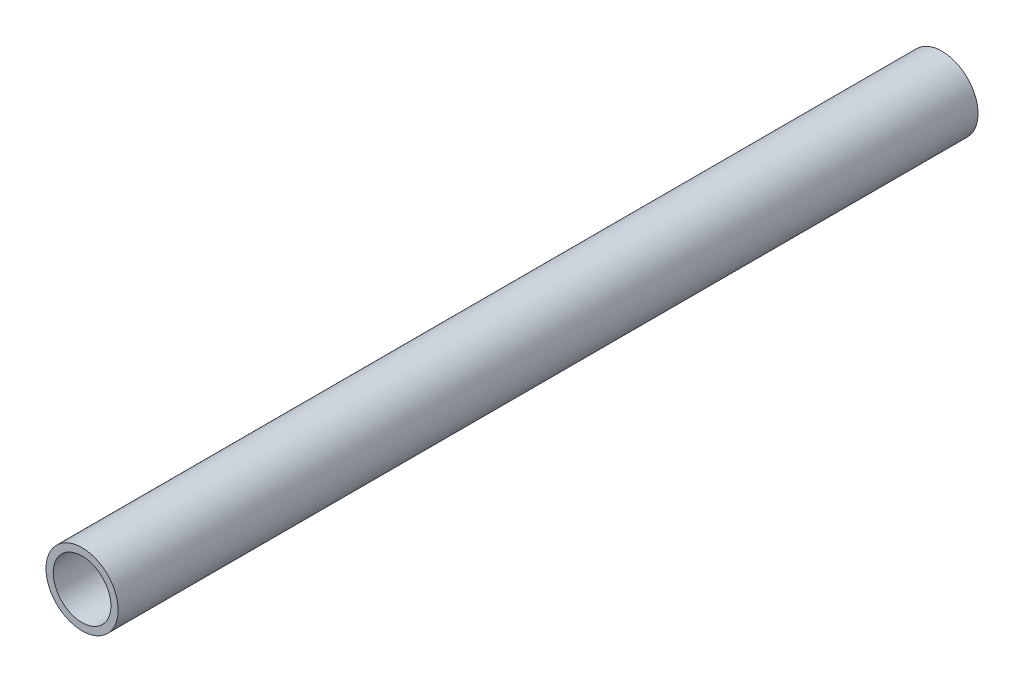
ISO-10303-21;
HEADER;
FILE_DESCRIPTION(('STEP AP214'),'2;1');
FILE_NAME('part.step','',(''),(''),'','','');
FILE_SCHEMA(('AUTOMOTIVE_DESIGN { 1 0 10303 214 1 1 1 1 }'));
ENDSEC;
DATA;
#1=APPLICATION_CONTEXT('core data for automotive mechanical design processes');
#2=APPLICATION_PROTOCOL_DEFINITION('international standard','automotive_design',2000,#1);
#3=PRODUCT_CONTEXT('',#1,'mechanical');
#4=PRODUCT('Part','Part','',(#3));
#5=PRODUCT_RELATED_PRODUCT_CATEGORY('part','',(#4));
#6=PRODUCT_DEFINITION_FORMATION('','',#4);
#7=PRODUCT_DEFINITION_CONTEXT('part definition',#1,'design');
#8=PRODUCT_DEFINITION('design','',#6,#7);
#9=PRODUCT_DEFINITION_SHAPE('','',#8);
#10=(LENGTH_UNIT() NAMED_UNIT(*) SI_UNIT(.MILLI.,.METRE.));
#11=(NAMED_UNIT(*) PLANE_ANGLE_UNIT() SI_UNIT($,.RADIAN.));
#12=(NAMED_UNIT(*) SI_UNIT($,.STERADIAN.) SOLID_ANGLE_UNIT());
#13=UNCERTAINTY_MEASURE_WITH_UNIT(LENGTH_MEASURE(1.E-05),#10,'distance_accuracy_value','');
#14=(GEOMETRIC_REPRESENTATION_CONTEXT(3) GLOBAL_UNCERTAINTY_ASSIGNED_CONTEXT((#13)) GLOBAL_UNIT_ASSIGNED_CONTEXT((#10,
#11,#12)) REPRESENTATION_CONTEXT('',''));
#15=CARTESIAN_POINT('',(0.,0.,0.));
#16=DIRECTION('',(0.,0.,1.));
#17=DIRECTION('',(1.,0.,0.));
#18=AXIS2_PLACEMENT_3D('',#15,#16,#17);
#19=CARTESIAN_POINT('',(0.,0.,75.692));
#20=DIRECTION('',(0.,0.,-1.));
#21=DIRECTION('',(-1.,0.,0.));
#22=AXIS2_PLACEMENT_3D('',#19,#20,#21);
#23=CYLINDRICAL_SURFACE('',#22,2.54);
#24=CARTESIAN_POINT('',(0.,0.,0.));
#25=DIRECTION('',(0.,0.,-1.));
#26=DIRECTION('',(-1.,0.,0.));
#27=AXIS2_PLACEMENT_3D('',#24,#25,#26);
#28=CIRCLE('',#27,2.54);
#29=CARTESIAN_POINT('',(-2.54,0.,0.));
#30=VERTEX_POINT('',#29);
#31=EDGE_CURVE('E27',#30,#30,#28,.T.);
#32=ORIENTED_EDGE('',*,*,#31,.T.);
#33=EDGE_LOOP('',(#32));
#34=FACE_BOUND('',#33,.T.);
#35=CARTESIAN_POINT('',(0.,0.,75.692));
#36=DIRECTION('',(0.,0.,-1.));
#37=DIRECTION('',(-1.,0.,0.));
#38=AXIS2_PLACEMENT_3D('',#35,#36,#37);
#39=CIRCLE('',#38,2.54);
#40=CARTESIAN_POINT('',(-2.54,0.,75.692));
#41=VERTEX_POINT('',#40);
#42=EDGE_CURVE('E18',#41,#41,#39,.T.);
#43=ORIENTED_EDGE('',*,*,#42,.F.);
#44=EDGE_LOOP('',(#43));
#45=FACE_BOUND('',#44,.T.);
#46=ADVANCED_FACE('F15',(#34,#45),#23,.F.);
#47=CARTESIAN_POINT('',(0.,0.,75.692));
#48=DIRECTION('',(0.,0.,1.));
#49=DIRECTION('',(1.,0.,0.));
#50=AXIS2_PLACEMENT_3D('',#47,#48,#49);
#51=PLANE('',#50);
#52=ORIENTED_EDGE('',*,*,#42,.T.);
#53=EDGE_LOOP('',(#52));
#54=FACE_BOUND('',#53,.T.);
#55=CARTESIAN_POINT('',(0.,0.,75.692));
#56=DIRECTION('',(0.,0.,-1.));
#57=DIRECTION('',(-1.,0.,0.));
#58=AXIS2_PLACEMENT_3D('',#55,#56,#57);
#59=CIRCLE('',#58,3.175);
#60=CARTESIAN_POINT('',(-3.175,0.,75.692));
#61=VERTEX_POINT('',#60);
#62=EDGE_CURVE('E22',#61,#61,#59,.T.);
#63=ORIENTED_EDGE('',*,*,#62,.F.);
#64=EDGE_LOOP('',(#63));
#65=FACE_BOUND('',#64,.T.);
#66=ADVANCED_FACE('F35',(#54,#65),#51,.T.);
#67=CARTESIAN_POINT('',(0.,0.,0.));
#68=DIRECTION('',(0.,0.,1.));
#69=DIRECTION('',(1.,0.,0.));
#70=AXIS2_PLACEMENT_3D('',#67,#68,#69);
#71=PLANE('',#70);
#72=ORIENTED_EDGE('',*,*,#31,.F.);
#73=EDGE_LOOP('',(#72));
#74=FACE_BOUND('',#73,.T.);
#75=CARTESIAN_POINT('',(0.,0.,0.));
#76=DIRECTION('',(0.,0.,-1.));
#77=DIRECTION('',(-1.,0.,0.));
#78=AXIS2_PLACEMENT_3D('',#75,#76,#77);
#79=CIRCLE('',#78,3.175);
#80=CARTESIAN_POINT('',(-3.175,0.,0.));
#81=VERTEX_POINT('',#80);
#82=EDGE_CURVE('E10',#81,#81,#79,.F.);
#83=ORIENTED_EDGE('',*,*,#82,.F.);
#84=EDGE_LOOP('',(#83));
#85=FACE_BOUND('',#84,.T.);
#86=ADVANCED_FACE('F43',(#74,#85),#71,.F.);
#87=CARTESIAN_POINT('',(0.,0.,75.692));
#88=DIRECTION('',(0.,0.,-1.));
#89=DIRECTION('',(-1.,0.,0.));
#90=AXIS2_PLACEMENT_3D('',#87,#88,#89);
#91=CYLINDRICAL_SURFACE('',#90,3.175);
#92=ORIENTED_EDGE('',*,*,#82,.T.);
#93=EDGE_LOOP('',(#92));
#94=FACE_BOUND('',#93,.T.);
#95=ORIENTED_EDGE('',*,*,#62,.T.);
#96=EDGE_LOOP('',(#95));
#97=FACE_BOUND('',#96,.T.);
#98=ADVANCED_FACE('F44',(#94,#97),#91,.T.);
#99=CLOSED_SHELL('',(#46,#66,#86,#98));
#100=MANIFOLD_SOLID_BREP('B1',#99);
#101=ADVANCED_BREP_SHAPE_REPRESENTATION('',(#18,#100),#14);
#102=SHAPE_DEFINITION_REPRESENTATION(#9,#101);
ENDSEC;
END-ISO-10303-21;
